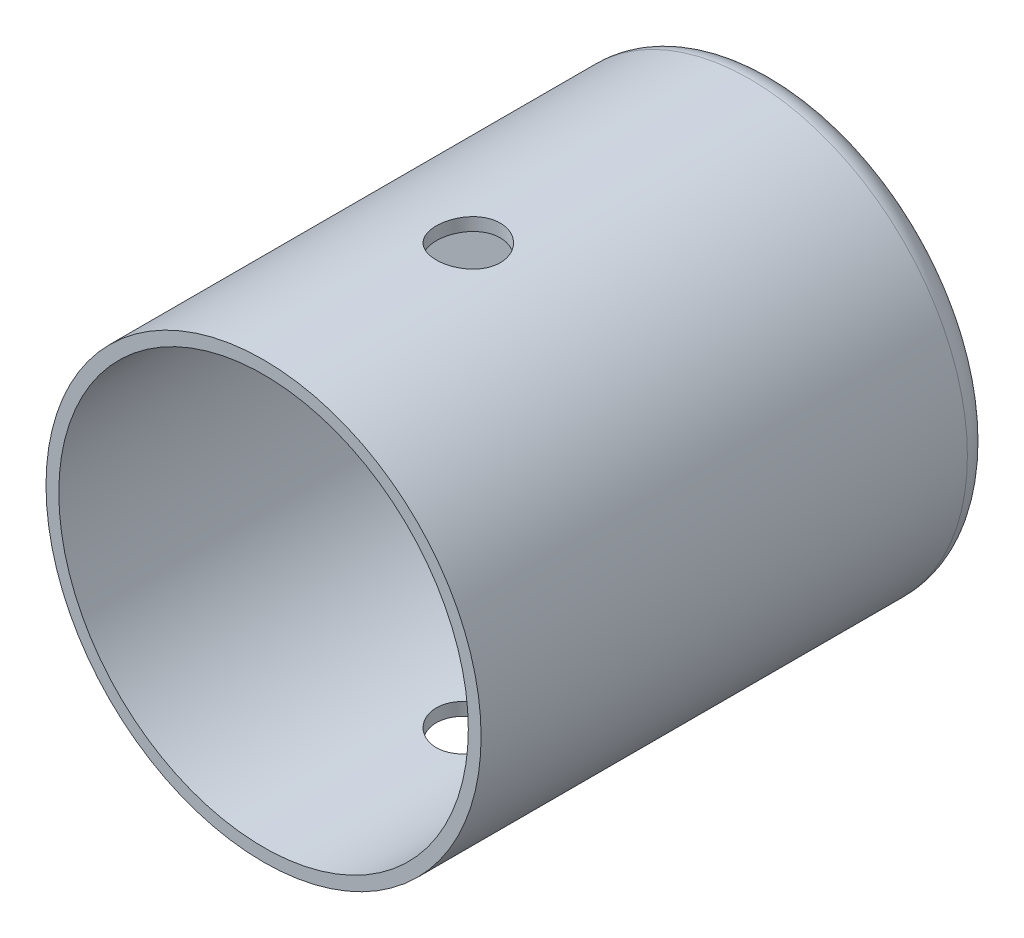
ISO-10303-21;
HEADER;
FILE_DESCRIPTION(('STEP AP214'),'2;1');
FILE_NAME('part.step','',(''),(''),'','','');
FILE_SCHEMA(('AUTOMOTIVE_DESIGN { 1 0 10303 214 1 1 1 1 }'));
ENDSEC;
DATA;
#1=APPLICATION_CONTEXT('core data for automotive mechanical design processes');
#2=APPLICATION_PROTOCOL_DEFINITION('international standard','automotive_design',2000,#1);
#3=PRODUCT_CONTEXT('',#1,'mechanical');
#4=PRODUCT('Part','Part','',(#3));
#5=PRODUCT_RELATED_PRODUCT_CATEGORY('part','',(#4));
#6=PRODUCT_DEFINITION_FORMATION('','',#4);
#7=PRODUCT_DEFINITION_CONTEXT('part definition',#1,'design');
#8=PRODUCT_DEFINITION('design','',#6,#7);
#9=PRODUCT_DEFINITION_SHAPE('','',#8);
#10=(LENGTH_UNIT() NAMED_UNIT(*) SI_UNIT(.MILLI.,.METRE.));
#11=(NAMED_UNIT(*) PLANE_ANGLE_UNIT() SI_UNIT($,.RADIAN.));
#12=(NAMED_UNIT(*) SI_UNIT($,.STERADIAN.) SOLID_ANGLE_UNIT());
#13=UNCERTAINTY_MEASURE_WITH_UNIT(LENGTH_MEASURE(1.E-05),#10,'distance_accuracy_value','');
#14=(GEOMETRIC_REPRESENTATION_CONTEXT(3) GLOBAL_UNCERTAINTY_ASSIGNED_CONTEXT((#13)) GLOBAL_UNIT_ASSIGNED_CONTEXT((#10,
#11,#12)) REPRESENTATION_CONTEXT('',''));
#15=CARTESIAN_POINT('',(0.,0.,0.));
#16=DIRECTION('',(0.,0.,1.));
#17=DIRECTION('',(1.,0.,0.));
#18=AXIS2_PLACEMENT_3D('',#15,#16,#17);
#19=CARTESIAN_POINT('',(0.,0.,12.));
#20=DIRECTION('',(0.,0.,-1.));
#21=DIRECTION('',(-1.,0.,0.));
#22=AXIS2_PLACEMENT_3D('',#19,#20,#21);
#23=CYLINDRICAL_SURFACE('',#22,17.);
#24=CARTESIAN_POINT('',(0.,0.,2.));
#25=DIRECTION('',(0.,0.,1.));
#26=DIRECTION('',(1.,0.,0.));
#27=AXIS2_PLACEMENT_3D('',#24,#25,#26);
#28=CIRCLE('',#27,17.);
#29=CARTESIAN_POINT('',(17.,0.,2.));
#30=VERTEX_POINT('',#29);
#31=EDGE_CURVE('E48',#30,#30,#28,.T.);
#32=ORIENTED_EDGE('',*,*,#31,.T.);
#33=EDGE_LOOP('',(#32));
#34=FACE_BOUND('',#33,.T.);
#35=CARTESIAN_POINT('',(0.,-17.,26.5));
#36=CARTESIAN_POINT('',(0.139618263933644,-16.999997793131,26.4999942181081));
#37=CARTESIAN_POINT('',(0.279318334742722,-16.9982619631343,26.4882645651211));
#38=CARTESIAN_POINT('',(0.554815864347195,-16.9915044414465,26.4416664885911));
#39=CARTESIAN_POINT('',(0.690609351356019,-16.9864795210156,26.4067753280472));
#40=CARTESIAN_POINT('',(0.954266664820791,-16.9737086836159,26.3149174733872));
#41=CARTESIAN_POINT('',(1.08213631987448,-16.9659647952965,26.2579672345128));
#42=CARTESIAN_POINT('',(1.3264840365203,-16.9486124241397,26.1236475337935));
#43=CARTESIAN_POINT('',(1.44296372374599,-16.9390042079744,26.0462809917132));
#44=CARTESIAN_POINT('',(1.66212119979329,-16.9189113868221,25.8727046523535));
#45=CARTESIAN_POINT('',(1.76470092382526,-16.9084213236713,25.7763716572785));
#46=CARTESIAN_POINT('',(1.95230070871524,-16.887789985922,25.5678620163514));
#47=CARTESIAN_POINT('',(2.03731977497713,-16.8776487311065,25.4556844737053));
#48=CARTESIAN_POINT('',(2.18776463859896,-16.8588102121396,25.2180137363662));
#49=CARTESIAN_POINT('',(2.25309591742832,-16.8501200004422,25.0924601042765));
#50=CARTESIAN_POINT('',(2.36170671911329,-16.8352417558288,24.8320129732306));
#51=CARTESIAN_POINT('',(2.40498739680279,-16.8290535918791,24.6971199638164));
#52=CARTESIAN_POINT('',(2.46796464304165,-16.819933589302,24.4228530062869));
#53=CARTESIAN_POINT('',(2.4878288374678,-16.8169786171038,24.2835183316785));
#54=CARTESIAN_POINT('',(2.50392846030982,-16.8145892786749,24.003464386118));
#55=CARTESIAN_POINT('',(2.50016519348747,-16.8151547180392,23.8627451920508));
#56=CARTESIAN_POINT('',(2.46925378270774,-16.8197211578168,23.5850988051509));
#57=CARTESIAN_POINT('',(2.44229207080977,-16.8236947679923,23.4481503408737));
#58=CARTESIAN_POINT('',(2.36604083270518,-16.8345870467401,23.1807425557001));
#59=CARTESIAN_POINT('',(2.31675069735604,-16.8415057956586,23.050283411947));
#60=CARTESIAN_POINT('',(2.19704705914093,-16.857539142223,22.7989887816149));
#61=CARTESIAN_POINT('',(2.12655433007144,-16.8666619500121,22.678191579542));
#62=CARTESIAN_POINT('',(1.96650298810832,-16.8860695216999,22.4500699591038));
#63=CARTESIAN_POINT('',(1.87694317178514,-16.8963543589216,22.3427463918144));
#64=CARTESIAN_POINT('',(1.6802753243751,-16.9170482652418,22.1435378637112));
#65=CARTESIAN_POINT('',(1.57300695254414,-16.9274575785055,22.0518111500901));
#66=CARTESIAN_POINT('',(1.34451413749424,-16.9471357134677,21.887638309751));
#67=CARTESIAN_POINT('',(1.22328963737823,-16.9564045305161,21.8151922616415));
#68=CARTESIAN_POINT('',(0.970190436846701,-16.9727664753804,21.6916301135368));
#69=CARTESIAN_POINT('',(0.838309834869857,-16.9798583870044,21.6405259310717));
#70=CARTESIAN_POINT('',(0.567710944898676,-16.991057196357,21.5612342283985));
#71=CARTESIAN_POINT('',(0.428993101669628,-16.9951642879764,21.5330452196304));
#72=CARTESIAN_POINT('',(0.15002351928223,-16.9999050818336,21.5005937968128));
#73=CARTESIAN_POINT('',(0.00979761097236531,-17.0005703732726,21.4961137704723));
#74=CARTESIAN_POINT('',(-0.269403415413676,-16.9984385067869,21.5106302951339));
#75=CARTESIAN_POINT('',(-0.408378570541142,-16.9956414517703,21.5296261483847));
#76=CARTESIAN_POINT('',(-0.680476104424862,-16.9869187192332,21.5903742721309));
#77=CARTESIAN_POINT('',(-0.813622595189718,-16.9810075822558,21.6320208091092));
#78=CARTESIAN_POINT('',(-1.07104301967474,-16.9667174597167,21.7367768070214));
#79=CARTESIAN_POINT('',(-1.19531655049811,-16.9583383621802,21.7998872418232));
#80=CARTESIAN_POINT('',(-1.43242218615397,-16.9399652839742,21.94629211294));
#81=CARTESIAN_POINT('',(-1.54516798121673,-16.9299603948874,22.0297249357443));
#82=CARTESIAN_POINT('',(-1.75513489222198,-16.9094840590999,22.2142131712884));
#83=CARTESIAN_POINT('',(-1.85235514217674,-16.8990125864157,22.3152695663831));
#84=CARTESIAN_POINT('',(-2.02930056628108,-16.8786834541762,22.5331038420833));
#85=CARTESIAN_POINT('',(-2.10888006584901,-16.8688313544641,22.6500006506408));
#86=CARTESIAN_POINT('',(-2.24727323997786,-16.8509540599789,22.8956301073293));
#87=CARTESIAN_POINT('',(-2.3060874583028,-16.8429288173692,23.0243624454214));
#88=CARTESIAN_POINT('',(-2.40105348668989,-16.8296538581595,23.2895698311896));
#89=CARTESIAN_POINT('',(-2.43728264767767,-16.8243946779348,23.4260166863741));
#90=CARTESIAN_POINT('',(-2.48629673443479,-16.8172219020188,23.7031411531762));
#91=CARTESIAN_POINT('',(-2.4990832109862,-16.815308085025,23.8438184843133));
#92=CARTESIAN_POINT('',(-2.50081314025998,-16.8150507670265,24.1239589898984));
#93=CARTESIAN_POINT('',(-2.48998561242761,-16.8166729719777,24.2634207727804));
#94=CARTESIAN_POINT('',(-2.4452849279886,-16.8232304869986,24.5385173126761));
#95=CARTESIAN_POINT('',(-2.41141180268506,-16.8281657925681,24.6741520748879));
#96=CARTESIAN_POINT('',(-2.32166128628094,-16.8407816094163,24.9376851195551));
#97=CARTESIAN_POINT('',(-2.265799280287,-16.8484602009356,25.065588739286));
#98=CARTESIAN_POINT('',(-2.13367943489691,-16.8656998369544,25.3102452268788));
#99=CARTESIAN_POINT('',(-2.05742095912403,-16.8752609401864,25.4269977466683));
#100=CARTESIAN_POINT('',(-1.88583847980749,-16.8952988011725,25.6472024177831));
#101=CARTESIAN_POINT('',(-1.79034469442663,-16.9057832085905,25.7505215943461));
#102=CARTESIAN_POINT('',(-1.58336095356046,-16.92642201351,25.9397507805396));
#103=CARTESIAN_POINT('',(-1.47186727949618,-16.9365763336202,26.0256567318852));
#104=CARTESIAN_POINT('',(-1.23535773881122,-16.9554718925697,26.1780241917968));
#105=CARTESIAN_POINT('',(-1.11027358494527,-16.9642053874589,26.2443806415313));
#106=CARTESIAN_POINT('',(-0.850667584310128,-16.9791991247469,26.3550443003183));
#107=CARTESIAN_POINT('',(-0.716155741284793,-16.9854619433621,26.3993744891167));
#108=CARTESIAN_POINT('',(-0.484190218187674,-16.9933688461727,26.4545995293981));
#109=CARTESIAN_POINT('',(-0.388172624228651,-16.9958428419025,26.4715988867554));
#110=CARTESIAN_POINT('',(-0.194783283695077,-16.9991591791261,26.4943010729119));
#111=CARTESIAN_POINT('',(-0.0974115529944623,-17.0000015397308,26.5000040340214));
#112=CARTESIAN_POINT('',(0.,-17.,26.5));
#113=B_SPLINE_CURVE_WITH_KNOTS('',3,(#35,#36,#37,#38,#39,#40,#41,#42,#43,#44,#45,#46,#47,#48,
#49,#50,#51,#52,#53,#54,#55,#56,#57,#58,#59,#60,#61,#62,#63,#64,#65,#66,#67,#68,#69,#70,#71,#72,
#73,#74,#75,#76,#77,#78,#79,#80,#81,#82,#83,#84,#85,#86,#87,#88,#89,#90,#91,#92,#93,#94,#95,#96,
#97,#98,#99,#100,#101,#102,#103,#104,#105,#106,#107,#108,#109,#110,#111,#112),.UNSPECIFIED.,.T.,
.F.,(4,2,2,2,2,2,2,2,2,2,2,2,2,2,2,2,2,2,2,2,2,2,2,2,2,2,2,2,2,2,2,2,2,2,2,2,2,2,4),(0.,
0.418498857511904,0.83740915233018,1.25600755579684,1.67454612732146,2.09589880308585,
2.51727533677714,2.94064374704006,3.3639899823766,3.78428694551126,4.20456069910212,
4.62148817747431,5.03842703074502,5.45694360373011,5.87548659945092,6.29805109091574,
6.72061730517519,7.14341917050654,7.56619356861207,7.98508072630458,8.40395543411031,
8.82089140788565,9.23784630155638,9.65772400348285,10.0776251172785,10.5008742387869,
10.9241122761825,11.3458926970847,11.7676452153327,12.1853255880243,12.6030053933771,
13.0203934758991,13.4377945825891,13.8590554809119,14.2804144447029,14.7039981269519,
15.1271389563846,15.4191287002785,15.7111150241882),.UNSPECIFIED.);
#114=CARTESIAN_POINT('',(0.,-17.,26.5));
#115=VERTEX_POINT('',#114);
#116=EDGE_CURVE('E91',#115,#115,#113,.T.);
#117=ORIENTED_EDGE('',*,*,#116,.T.);
#118=EDGE_LOOP('',(#117));
#119=FACE_BOUND('',#118,.T.);
#120=CARTESIAN_POINT('',(0.,17.,26.5));
#121=CARTESIAN_POINT('',(-0.139618263933644,16.999997793131,26.4999942181081));
#122=CARTESIAN_POINT('',(-0.279318334742722,16.9982619631343,26.4882645651211));
#123=CARTESIAN_POINT('',(-0.554815864347195,16.9915044414465,26.4416664885911));
#124=CARTESIAN_POINT('',(-0.690609351356019,16.9864795210156,26.4067753280472));
#125=CARTESIAN_POINT('',(-0.954266664820791,16.9737086836159,26.3149174733872));
#126=CARTESIAN_POINT('',(-1.08213631987448,16.9659647952965,26.2579672345128));
#127=CARTESIAN_POINT('',(-1.3264840365203,16.9486124241397,26.1236475337935));
#128=CARTESIAN_POINT('',(-1.44296372374599,16.9390042079744,26.0462809917132));
#129=CARTESIAN_POINT('',(-1.66212119979329,16.9189113868221,25.8727046523535));
#130=CARTESIAN_POINT('',(-1.76470092382526,16.9084213236713,25.7763716572785));
#131=CARTESIAN_POINT('',(-1.95230070871524,16.887789985922,25.5678620163514));
#132=CARTESIAN_POINT('',(-2.03731977497713,16.8776487311065,25.4556844737053));
#133=CARTESIAN_POINT('',(-2.18776463859896,16.8588102121396,25.2180137363662));
#134=CARTESIAN_POINT('',(-2.25309591742832,16.8501200004422,25.0924601042765));
#135=CARTESIAN_POINT('',(-2.36170671911329,16.8352417558288,24.8320129732306));
#136=CARTESIAN_POINT('',(-2.40498739680279,16.8290535918791,24.6971199638164));
#137=CARTESIAN_POINT('',(-2.46796464304165,16.819933589302,24.4228530062869));
#138=CARTESIAN_POINT('',(-2.4878288374678,16.8169786171038,24.2835183316785));
#139=CARTESIAN_POINT('',(-2.50392846030982,16.8145892786749,24.003464386118));
#140=CARTESIAN_POINT('',(-2.50016519348747,16.8151547180392,23.8627451920508));
#141=CARTESIAN_POINT('',(-2.46925378270774,16.8197211578168,23.5850988051509));
#142=CARTESIAN_POINT('',(-2.44229207080977,16.8236947679923,23.4481503408737));
#143=CARTESIAN_POINT('',(-2.36604083270518,16.8345870467401,23.1807425557001));
#144=CARTESIAN_POINT('',(-2.31675069735604,16.8415057956586,23.050283411947));
#145=CARTESIAN_POINT('',(-2.19704705914093,16.857539142223,22.7989887816149));
#146=CARTESIAN_POINT('',(-2.12655433007144,16.8666619500121,22.678191579542));
#147=CARTESIAN_POINT('',(-1.96650298810832,16.8860695216999,22.4500699591038));
#148=CARTESIAN_POINT('',(-1.87694317178514,16.8963543589216,22.3427463918144));
#149=CARTESIAN_POINT('',(-1.6802753243751,16.9170482652418,22.1435378637112));
#150=CARTESIAN_POINT('',(-1.57300695254414,16.9274575785055,22.0518111500901));
#151=CARTESIAN_POINT('',(-1.34451413749424,16.9471357134677,21.887638309751));
#152=CARTESIAN_POINT('',(-1.22328963737823,16.9564045305161,21.8151922616415));
#153=CARTESIAN_POINT('',(-0.970190436846701,16.9727664753804,21.6916301135368));
#154=CARTESIAN_POINT('',(-0.838309834869857,16.9798583870044,21.6405259310717));
#155=CARTESIAN_POINT('',(-0.567710944898676,16.991057196357,21.5612342283985));
#156=CARTESIAN_POINT('',(-0.428993101669628,16.9951642879764,21.5330452196304));
#157=CARTESIAN_POINT('',(-0.15002351928223,16.9999050818336,21.5005937968128));
#158=CARTESIAN_POINT('',(-0.00979761097236531,17.0005703732726,21.4961137704723));
#159=CARTESIAN_POINT('',(0.269403415413676,16.9984385067869,21.5106302951339));
#160=CARTESIAN_POINT('',(0.408378570541142,16.9956414517703,21.5296261483847));
#161=CARTESIAN_POINT('',(0.680476104424862,16.9869187192332,21.5903742721309));
#162=CARTESIAN_POINT('',(0.813622595189718,16.9810075822558,21.6320208091092));
#163=CARTESIAN_POINT('',(1.07104301967474,16.9667174597167,21.7367768070214));
#164=CARTESIAN_POINT('',(1.19531655049811,16.9583383621802,21.7998872418232));
#165=CARTESIAN_POINT('',(1.43242218615397,16.9399652839742,21.94629211294));
#166=CARTESIAN_POINT('',(1.54516798121673,16.9299603948874,22.0297249357443));
#167=CARTESIAN_POINT('',(1.75513489222198,16.9094840590999,22.2142131712884));
#168=CARTESIAN_POINT('',(1.85235514217674,16.8990125864157,22.3152695663831));
#169=CARTESIAN_POINT('',(2.02930056628108,16.8786834541762,22.5331038420833));
#170=CARTESIAN_POINT('',(2.10888006584901,16.8688313544641,22.6500006506408));
#171=CARTESIAN_POINT('',(2.24727323997786,16.8509540599789,22.8956301073293));
#172=CARTESIAN_POINT('',(2.3060874583028,16.8429288173692,23.0243624454214));
#173=CARTESIAN_POINT('',(2.40105348668989,16.8296538581595,23.2895698311896));
#174=CARTESIAN_POINT('',(2.43728264767767,16.8243946779348,23.4260166863741));
#175=CARTESIAN_POINT('',(2.48629673443479,16.8172219020188,23.7031411531762));
#176=CARTESIAN_POINT('',(2.4990832109862,16.815308085025,23.8438184843133));
#177=CARTESIAN_POINT('',(2.50081314025998,16.8150507670265,24.1239589898984));
#178=CARTESIAN_POINT('',(2.48998561242761,16.8166729719777,24.2634207727804));
#179=CARTESIAN_POINT('',(2.4452849279886,16.8232304869986,24.5385173126761));
#180=CARTESIAN_POINT('',(2.41141180268506,16.8281657925681,24.6741520748879));
#181=CARTESIAN_POINT('',(2.32166128628094,16.8407816094163,24.9376851195551));
#182=CARTESIAN_POINT('',(2.265799280287,16.8484602009356,25.065588739286));
#183=CARTESIAN_POINT('',(2.13367943489691,16.8656998369544,25.3102452268788));
#184=CARTESIAN_POINT('',(2.05742095912403,16.8752609401864,25.4269977466683));
#185=CARTESIAN_POINT('',(1.88583847980749,16.8952988011725,25.6472024177831));
#186=CARTESIAN_POINT('',(1.79034469442663,16.9057832085905,25.7505215943461));
#187=CARTESIAN_POINT('',(1.58336095356046,16.92642201351,25.9397507805396));
#188=CARTESIAN_POINT('',(1.47186727949618,16.9365763336202,26.0256567318852));
#189=CARTESIAN_POINT('',(1.23535773881122,16.9554718925697,26.1780241917968));
#190=CARTESIAN_POINT('',(1.11027358494527,16.9642053874589,26.2443806415313));
#191=CARTESIAN_POINT('',(0.850667584310128,16.9791991247469,26.3550443003183));
#192=CARTESIAN_POINT('',(0.716155741284793,16.9854619433621,26.3993744891167));
#193=CARTESIAN_POINT('',(0.484190218187674,16.9933688461727,26.4545995293981));
#194=CARTESIAN_POINT('',(0.388172624228651,16.9958428419025,26.4715988867554));
#195=CARTESIAN_POINT('',(0.194783283695077,16.9991591791261,26.4943010729119));
#196=CARTESIAN_POINT('',(0.0974115529944623,17.0000015397308,26.5000040340214));
#197=CARTESIAN_POINT('',(0.,17.,26.5));
#198=B_SPLINE_CURVE_WITH_KNOTS('',3,(#120,#121,#122,#123,#124,#125,#126,#127,#128,#129,#130,
#131,#132,#133,#134,#135,#136,#137,#138,#139,#140,#141,#142,#143,#144,#145,#146,#147,#148,#149,
#150,#151,#152,#153,#154,#155,#156,#157,#158,#159,#160,#161,#162,#163,#164,#165,#166,#167,#168,
#169,#170,#171,#172,#173,#174,#175,#176,#177,#178,#179,#180,#181,#182,#183,#184,#185,#186,#187,
#188,#189,#190,#191,#192,#193,#194,#195,#196,#197),.UNSPECIFIED.,.T.,.F.,(4,2,2,2,2,2,2,2,2,2,2,
2,2,2,2,2,2,2,2,2,2,2,2,2,2,2,2,2,2,2,2,2,2,2,2,2,2,2,4),(0.,0.418498857511904,0.83740915233018,
1.25600755579684,1.67454612732146,2.09589880308585,2.51727533677714,2.94064374704006,
3.3639899823766,3.78428694551126,4.20456069910212,4.62148817747431,5.03842703074502,
5.45694360373011,5.87548659945092,6.29805109091574,6.72061730517519,7.14341917050654,
7.56619356861207,7.98508072630458,8.40395543411031,8.82089140788565,9.23784630155638,
9.65772400348285,10.0776251172785,10.5008742387869,10.9241122761825,11.3458926970847,
11.7676452153327,12.1853255880243,12.6030053933771,13.0203934758991,13.4377945825891,
13.8590554809119,14.2804144447029,14.7039981269519,15.1271389563846,15.4191287002785,
15.7111150241882),.UNSPECIFIED.);
#199=CARTESIAN_POINT('',(0.,17.,26.5));
#200=VERTEX_POINT('',#199);
#201=EDGE_CURVE('E67',#200,#200,#198,.T.);
#202=ORIENTED_EDGE('',*,*,#201,.T.);
#203=EDGE_LOOP('',(#202));
#204=FACE_BOUND('',#203,.T.);
#205=CARTESIAN_POINT('',(0.,0.,40.));
#206=DIRECTION('',(0.,0.,1.));
#207=DIRECTION('',(1.,0.,0.));
#208=AXIS2_PLACEMENT_3D('',#205,#206,#207);
#209=CIRCLE('',#208,17.);
#210=CARTESIAN_POINT('',(17.,0.,40.));
#211=VERTEX_POINT('',#210);
#212=EDGE_CURVE('E56',#211,#211,#209,.T.);
#213=ORIENTED_EDGE('',*,*,#212,.F.);
#214=EDGE_LOOP('',(#213));
#215=FACE_BOUND('',#214,.T.);
#216=ADVANCED_FACE('F41',(#34,#119,#204,#215),#23,.T.);
#217=CARTESIAN_POINT('',(0.,0.,0.));
#218=DIRECTION('',(0.,0.,1.));
#219=DIRECTION('',(1.,0.,0.));
#220=AXIS2_PLACEMENT_3D('',#217,#218,#219);
#221=PLANE('',#220);
#222=CARTESIAN_POINT('',(0.,0.,0.));
#223=DIRECTION('',(0.,0.,1.));
#224=DIRECTION('',(1.,0.,0.));
#225=AXIS2_PLACEMENT_3D('',#222,#223,#224);
#226=CIRCLE('',#225,15.);
#227=CARTESIAN_POINT('',(15.,0.,0.));
#228=VERTEX_POINT('',#227);
#229=EDGE_CURVE('E10',#228,#228,#226,.F.);
#230=ORIENTED_EDGE('',*,*,#229,.T.);
#231=EDGE_LOOP('',(#230));
#232=FACE_BOUND('',#231,.T.);
#233=ADVANCED_FACE('F99',(#232),#221,.F.);
#234=CARTESIAN_POINT('',(0.,0.,40.));
#235=DIRECTION('',(0.,0.,-1.));
#236=DIRECTION('',(-1.,0.,0.));
#237=AXIS2_PLACEMENT_3D('',#234,#235,#236);
#238=CYLINDRICAL_SURFACE('',#237,16.);
#239=CARTESIAN_POINT('',(0.,-16.,26.5));
#240=CARTESIAN_POINT('',(0.139515097271033,-15.9999977019448,26.4999943017285));
#241=CARTESIAN_POINT('',(0.279109404865704,-15.9981561248574,26.4882818862264));
#242=CARTESIAN_POINT('',(0.554391314978102,-15.9909869809759,26.4417563087232));
#243=CARTESIAN_POINT('',(0.690075061323317,-15.9856560884472,26.4069211074965));
#244=CARTESIAN_POINT('',(0.953512538047403,-15.9721069716578,26.3152203371934));
#245=CARTESIAN_POINT('',(1.0812723522899,-15.9638909956317,26.2583719186384));
#246=CARTESIAN_POINT('',(1.3254212510446,-15.9454779403815,26.1243014548584));
#247=CARTESIAN_POINT('',(1.44181181036831,-15.9352811186255,26.0470820569641));
#248=CARTESIAN_POINT('',(1.66091991165162,-15.9139426841436,25.873766951646));
#249=CARTESIAN_POINT('',(1.76352747914264,-15.9027945139234,25.7775330051098));
#250=CARTESIAN_POINT('',(1.95120768822823,-15.8808607613029,25.5692180517311));
#251=CARTESIAN_POINT('',(2.03627928654192,-15.8700752005075,25.4571361026998));
#252=CARTESIAN_POINT('',(2.18690544328884,-15.8500242812745,25.2195617286563));
#253=CARTESIAN_POINT('',(2.25235273557991,-15.840767397861,25.0940005176382));
#254=CARTESIAN_POINT('',(2.36118681597065,-15.8249120174236,24.8334985891422));
#255=CARTESIAN_POINT('',(2.40457491010063,-15.8183133630222,24.6985584274894));
#256=CARTESIAN_POINT('',(2.46771559322167,-15.8085863451104,24.4242890988562));
#257=CARTESIAN_POINT('',(2.48765705487496,-15.8054302653236,24.2850044141812));
#258=CARTESIAN_POINT('',(2.50392369757621,-15.8028617107177,24.0050328111074));
#259=CARTESIAN_POINT('',(2.50025034860466,-15.8034490028802,23.864345980534));
#260=CARTESIAN_POINT('',(2.4695458080889,-15.8082755045521,23.5869029681473));
#261=CARTESIAN_POINT('',(2.44272562959693,-15.8124817218495,23.4501227766469));
#262=CARTESIAN_POINT('',(2.36681937833751,-15.8240205634547,23.1830279936407));
#263=CARTESIAN_POINT('',(2.31773262684132,-15.8313532830641,23.0527135993595));
#264=CARTESIAN_POINT('',(2.19846916949384,-15.8483550685462,22.8016112873228));
#265=CARTESIAN_POINT('',(2.12820372315549,-15.8580339308724,22.6808662082269));
#266=CARTESIAN_POINT('',(1.96864058146637,-15.878630461501,22.4528004643145));
#267=CARTESIAN_POINT('',(1.87934153253017,-15.8895482178821,22.3454807551125));
#268=CARTESIAN_POINT('',(1.68309088822333,-15.911537862489,22.1460897533667));
#269=CARTESIAN_POINT('',(1.57595800560539,-15.9226101363559,22.0541968417305));
#270=CARTESIAN_POINT('',(1.34769694737936,-15.9435512534783,21.8896668543601));
#271=CARTESIAN_POINT('',(1.22656870068132,-15.9534200906202,21.8170298764432));
#272=CARTESIAN_POINT('',(0.973595927056489,-15.9708539902704,21.6930619265776));
#273=CARTESIAN_POINT('',(0.841744186240459,-15.9784174854193,21.641745441467));
#274=CARTESIAN_POINT('',(0.571149534696758,-15.9903756000068,21.5620340325528));
#275=CARTESIAN_POINT('',(0.432407130687199,-15.9947704520898,21.5336374259335));
#276=CARTESIAN_POINT('',(0.153508336763734,-15.9998651172728,21.5008107235498));
#277=CARTESIAN_POINT('',(0.013381461508701,-16.0006027179286,21.4961355210238));
#278=CARTESIAN_POINT('',(-0.265654546411643,-15.9984028649127,21.510232705336));
#279=CARTESIAN_POINT('',(-0.404563719925156,-15.9954655349964,21.5290043025891));
#280=CARTESIAN_POINT('',(-0.676473446265704,-15.9862692369322,21.5892583876802));
#281=CARTESIAN_POINT('',(-0.80950126205604,-15.9800278421539,21.6306207582677));
#282=CARTESIAN_POINT('',(-1.06673406785662,-15.9649207568356,21.7347550943988));
#283=CARTESIAN_POINT('',(-1.19093861303941,-15.9560549341007,21.7975281384427));
#284=CARTESIAN_POINT('',(-1.42807220225041,-15.9365897274094,21.9432719911266));
#285=CARTESIAN_POINT('',(-1.54090512378372,-15.9259772866342,22.0263974200905));
#286=CARTESIAN_POINT('',(-1.75110696507806,-15.9042388046444,22.2102720859078));
#287=CARTESIAN_POINT('',(-1.84847490447018,-15.8931127309268,22.3110224392049));
#288=CARTESIAN_POINT('',(-2.02588080776691,-15.8714802753665,22.5283811972172));
#289=CARTESIAN_POINT('',(-2.10575398584126,-15.860980411908,22.6451248471223));
#290=CARTESIAN_POINT('',(-2.2447556772664,-15.8419069280583,22.8905160736613));
#291=CARTESIAN_POINT('',(-2.30388478778105,-15.83333325222,23.0191633074895));
#292=CARTESIAN_POINT('',(-2.39946771944995,-15.8191307135236,23.2842296407142));
#293=CARTESIAN_POINT('',(-2.43600654947912,-15.8134908234896,23.4206174687656));
#294=CARTESIAN_POINT('',(-2.48564122040535,-15.8057657028079,23.697689143664));
#295=CARTESIAN_POINT('',(-2.49873883084997,-15.8036802038444,23.838372665419));
#296=CARTESIAN_POINT('',(-2.50107452690756,-15.8033105804488,24.1183987159075));
#297=CARTESIAN_POINT('',(-2.49057180548425,-15.804985160429,24.2577390969335));
#298=CARTESIAN_POINT('',(-2.44656223255901,-15.8118569894183,24.5326452971443));
#299=CARTESIAN_POINT('',(-2.41305543086961,-15.8170542307995,24.6682111245017));
#300=CARTESIAN_POINT('',(-2.32408329891851,-15.8303708885491,24.9316378266405));
#301=CARTESIAN_POINT('',(-2.26863761738581,-15.8384876895341,25.0595054782584));
#302=CARTESIAN_POINT('',(-2.13738768546417,-15.856731840474,25.3041656136763));
#303=CARTESIAN_POINT('',(-2.06158262820886,-15.8668592701083,25.4209576582884));
#304=CARTESIAN_POINT('',(-1.89083008139079,-15.8881156809226,25.6414655441268));
#305=CARTESIAN_POINT('',(-1.79569107094768,-15.8992540116029,25.7450321966138));
#306=CARTESIAN_POINT('',(-1.58937594638204,-15.9212004364073,25.9348212363867));
#307=CARTESIAN_POINT('',(-1.47819612078432,-15.9320084534012,26.0210395985919));
#308=CARTESIAN_POINT('',(-1.24216685884341,-15.952151024567,26.1741512230316));
#309=CARTESIAN_POINT('',(-1.11723937214238,-15.9614763443027,26.2409253727596));
#310=CARTESIAN_POINT('',(-0.857851882357782,-15.9775125983888,26.3524409961929));
#311=CARTESIAN_POINT('',(-0.72340177658176,-15.9842262014212,26.3972049725584));
#312=CARTESIAN_POINT('',(-0.490314239911593,-15.9927744586488,26.4534330210906));
#313=CARTESIAN_POINT('',(-0.393105575651624,-15.9954699162612,26.470868490629));
#314=CARTESIAN_POINT('',(-0.197277797850582,-15.9990834869762,26.4941539133791));
#315=CARTESIAN_POINT('',(-0.0986587041691185,-16.0000016250796,26.5000040295573));
#316=CARTESIAN_POINT('',(0.,-16.,26.5));
#317=B_SPLINE_CURVE_WITH_KNOTS('',3,(#239,#240,#241,#242,#243,#244,#245,#246,#247,#248,#249,
#250,#251,#252,#253,#254,#255,#256,#257,#258,#259,#260,#261,#262,#263,#264,#265,#266,#267,#268,
#269,#270,#271,#272,#273,#274,#275,#276,#277,#278,#279,#280,#281,#282,#283,#284,#285,#286,#287,
#288,#289,#290,#291,#292,#293,#294,#295,#296,#297,#298,#299,#300,#301,#302,#303,#304,#305,#306,
#307,#308,#309,#310,#311,#312,#313,#314,#315,#316),.UNSPECIFIED.,.T.,.F.,(4,2,2,2,2,2,2,2,2,2,2,
2,2,2,2,2,2,2,2,2,2,2,2,2,2,2,2,2,2,2,2,2,2,2,2,2,2,2,4),(0.,0.418184740477491,
0.836768642528014,1.25502707944103,1.6732311879203,2.09459568152199,2.51598523645422,
2.93963778605759,3.36326525009238,3.78345631134995,4.20362121670545,4.6199957602258,
5.0363829965105,5.45453977402347,5.87272629892068,6.29545732334367,6.71819049513827,
7.14121043754564,7.56419931829866,7.98280854005914,8.40140366528356,8.81779444756566,
9.2342062074203,9.65388541469671,10.0735912160142,10.4970948024959,10.9205861964898,
11.3424741039513,11.764330162293,12.1815758159869,12.598820566189,13.0156924696662,
13.4325808967135,13.8538201231554,14.275156971423,14.6990230419984,15.1224548565628,
15.4181801635154,15.7139013105871),.UNSPECIFIED.);
#318=CARTESIAN_POINT('',(0.,-16.,26.5));
#319=VERTEX_POINT('',#318);
#320=EDGE_CURVE('E59',#319,#319,#317,.T.);
#321=ORIENTED_EDGE('',*,*,#320,.F.);
#322=EDGE_LOOP('',(#321));
#323=FACE_BOUND('',#322,.T.);
#324=CARTESIAN_POINT('',(0.,16.,26.5));
#325=CARTESIAN_POINT('',(-0.139515097271033,15.9999977019448,26.4999943017285));
#326=CARTESIAN_POINT('',(-0.279109404865704,15.9981561248574,26.4882818862264));
#327=CARTESIAN_POINT('',(-0.554391314978102,15.9909869809759,26.4417563087232));
#328=CARTESIAN_POINT('',(-0.690075061323317,15.9856560884472,26.4069211074965));
#329=CARTESIAN_POINT('',(-0.953512538047403,15.9721069716578,26.3152203371934));
#330=CARTESIAN_POINT('',(-1.0812723522899,15.9638909956317,26.2583719186384));
#331=CARTESIAN_POINT('',(-1.3254212510446,15.9454779403815,26.1243014548584));
#332=CARTESIAN_POINT('',(-1.44181181036831,15.9352811186255,26.0470820569641));
#333=CARTESIAN_POINT('',(-1.66091991165162,15.9139426841436,25.873766951646));
#334=CARTESIAN_POINT('',(-1.76352747914264,15.9027945139234,25.7775330051098));
#335=CARTESIAN_POINT('',(-1.95120768822823,15.8808607613029,25.5692180517311));
#336=CARTESIAN_POINT('',(-2.03627928654192,15.8700752005075,25.4571361026998));
#337=CARTESIAN_POINT('',(-2.18690544328884,15.8500242812745,25.2195617286563));
#338=CARTESIAN_POINT('',(-2.25235273557991,15.840767397861,25.0940005176382));
#339=CARTESIAN_POINT('',(-2.36118681597065,15.8249120174236,24.8334985891422));
#340=CARTESIAN_POINT('',(-2.40457491010063,15.8183133630222,24.6985584274894));
#341=CARTESIAN_POINT('',(-2.46771559322167,15.8085863451104,24.4242890988562));
#342=CARTESIAN_POINT('',(-2.48765705487496,15.8054302653236,24.2850044141812));
#343=CARTESIAN_POINT('',(-2.50392369757621,15.8028617107177,24.0050328111074));
#344=CARTESIAN_POINT('',(-2.50025034860466,15.8034490028802,23.864345980534));
#345=CARTESIAN_POINT('',(-2.4695458080889,15.8082755045521,23.5869029681473));
#346=CARTESIAN_POINT('',(-2.44272562959693,15.8124817218495,23.4501227766469));
#347=CARTESIAN_POINT('',(-2.36681937833751,15.8240205634547,23.1830279936407));
#348=CARTESIAN_POINT('',(-2.31773262684132,15.8313532830641,23.0527135993595));
#349=CARTESIAN_POINT('',(-2.19846916949384,15.8483550685462,22.8016112873228));
#350=CARTESIAN_POINT('',(-2.12820372315549,15.8580339308724,22.6808662082269));
#351=CARTESIAN_POINT('',(-1.96864058146637,15.878630461501,22.4528004643145));
#352=CARTESIAN_POINT('',(-1.87934153253017,15.8895482178821,22.3454807551125));
#353=CARTESIAN_POINT('',(-1.68309088822333,15.911537862489,22.1460897533667));
#354=CARTESIAN_POINT('',(-1.57595800560539,15.9226101363559,22.0541968417305));
#355=CARTESIAN_POINT('',(-1.34769694737936,15.9435512534783,21.8896668543601));
#356=CARTESIAN_POINT('',(-1.22656870068132,15.9534200906202,21.8170298764432));
#357=CARTESIAN_POINT('',(-0.973595927056489,15.9708539902704,21.6930619265776));
#358=CARTESIAN_POINT('',(-0.841744186240459,15.9784174854193,21.641745441467));
#359=CARTESIAN_POINT('',(-0.571149534696758,15.9903756000068,21.5620340325528));
#360=CARTESIAN_POINT('',(-0.432407130687199,15.9947704520898,21.5336374259335));
#361=CARTESIAN_POINT('',(-0.153508336763734,15.9998651172728,21.5008107235498));
#362=CARTESIAN_POINT('',(-0.013381461508701,16.0006027179286,21.4961355210238));
#363=CARTESIAN_POINT('',(0.265654546411643,15.9984028649127,21.510232705336));
#364=CARTESIAN_POINT('',(0.404563719925156,15.9954655349964,21.5290043025891));
#365=CARTESIAN_POINT('',(0.676473446265704,15.9862692369322,21.5892583876802));
#366=CARTESIAN_POINT('',(0.80950126205604,15.9800278421539,21.6306207582677));
#367=CARTESIAN_POINT('',(1.06673406785662,15.9649207568356,21.7347550943988));
#368=CARTESIAN_POINT('',(1.19093861303941,15.9560549341007,21.7975281384427));
#369=CARTESIAN_POINT('',(1.42807220225041,15.9365897274094,21.9432719911266));
#370=CARTESIAN_POINT('',(1.54090512378372,15.9259772866342,22.0263974200905));
#371=CARTESIAN_POINT('',(1.75110696507806,15.9042388046444,22.2102720859078));
#372=CARTESIAN_POINT('',(1.84847490447018,15.8931127309268,22.3110224392049));
#373=CARTESIAN_POINT('',(2.02588080776691,15.8714802753665,22.5283811972172));
#374=CARTESIAN_POINT('',(2.10575398584126,15.860980411908,22.6451248471223));
#375=CARTESIAN_POINT('',(2.2447556772664,15.8419069280583,22.8905160736613));
#376=CARTESIAN_POINT('',(2.30388478778105,15.83333325222,23.0191633074895));
#377=CARTESIAN_POINT('',(2.39946771944995,15.8191307135236,23.2842296407142));
#378=CARTESIAN_POINT('',(2.43600654947912,15.8134908234896,23.4206174687656));
#379=CARTESIAN_POINT('',(2.48564122040535,15.8057657028079,23.697689143664));
#380=CARTESIAN_POINT('',(2.49873883084997,15.8036802038444,23.838372665419));
#381=CARTESIAN_POINT('',(2.50107452690756,15.8033105804488,24.1183987159075));
#382=CARTESIAN_POINT('',(2.49057180548425,15.804985160429,24.2577390969335));
#383=CARTESIAN_POINT('',(2.44656223255901,15.8118569894183,24.5326452971443));
#384=CARTESIAN_POINT('',(2.41305543086961,15.8170542307995,24.6682111245017));
#385=CARTESIAN_POINT('',(2.32408329891851,15.8303708885491,24.9316378266405));
#386=CARTESIAN_POINT('',(2.26863761738581,15.8384876895341,25.0595054782584));
#387=CARTESIAN_POINT('',(2.13738768546417,15.856731840474,25.3041656136763));
#388=CARTESIAN_POINT('',(2.06158262820886,15.8668592701083,25.4209576582884));
#389=CARTESIAN_POINT('',(1.89083008139079,15.8881156809226,25.6414655441268));
#390=CARTESIAN_POINT('',(1.79569107094768,15.8992540116029,25.7450321966138));
#391=CARTESIAN_POINT('',(1.58937594638204,15.9212004364073,25.9348212363867));
#392=CARTESIAN_POINT('',(1.47819612078432,15.9320084534012,26.0210395985919));
#393=CARTESIAN_POINT('',(1.24216685884341,15.952151024567,26.1741512230316));
#394=CARTESIAN_POINT('',(1.11723937214238,15.9614763443027,26.2409253727596));
#395=CARTESIAN_POINT('',(0.857851882357782,15.9775125983888,26.3524409961929));
#396=CARTESIAN_POINT('',(0.72340177658176,15.9842262014212,26.3972049725584));
#397=CARTESIAN_POINT('',(0.490314239911593,15.9927744586488,26.4534330210906));
#398=CARTESIAN_POINT('',(0.393105575651624,15.9954699162612,26.470868490629));
#399=CARTESIAN_POINT('',(0.197277797850582,15.9990834869762,26.4941539133791));
#400=CARTESIAN_POINT('',(0.0986587041691185,16.0000016250796,26.5000040295573));
#401=CARTESIAN_POINT('',(0.,16.,26.5));
#402=B_SPLINE_CURVE_WITH_KNOTS('',3,(#324,#325,#326,#327,#328,#329,#330,#331,#332,#333,#334,
#335,#336,#337,#338,#339,#340,#341,#342,#343,#344,#345,#346,#347,#348,#349,#350,#351,#352,#353,
#354,#355,#356,#357,#358,#359,#360,#361,#362,#363,#364,#365,#366,#367,#368,#369,#370,#371,#372,
#373,#374,#375,#376,#377,#378,#379,#380,#381,#382,#383,#384,#385,#386,#387,#388,#389,#390,#391,
#392,#393,#394,#395,#396,#397,#398,#399,#400,#401),.UNSPECIFIED.,.T.,.F.,(4,2,2,2,2,2,2,2,2,2,2,
2,2,2,2,2,2,2,2,2,2,2,2,2,2,2,2,2,2,2,2,2,2,2,2,2,2,2,4),(0.,0.418184740477491,
0.836768642528014,1.25502707944103,1.6732311879203,2.09459568152199,2.51598523645422,
2.93963778605759,3.36326525009238,3.78345631134995,4.20362121670545,4.6199957602258,
5.0363829965105,5.45453977402347,5.87272629892068,6.29545732334367,6.71819049513827,
7.14121043754564,7.56419931829866,7.98280854005914,8.40140366528356,8.81779444756566,
9.2342062074203,9.65388541469671,10.0735912160142,10.4970948024959,10.9205861964898,
11.3424741039513,11.764330162293,12.1815758159869,12.598820566189,13.0156924696662,
13.4325808967135,13.8538201231554,14.275156971423,14.6990230419984,15.1224548565628,
15.4181801635154,15.7139013105871),.UNSPECIFIED.);
#403=CARTESIAN_POINT('',(0.,16.,26.5));
#404=VERTEX_POINT('',#403);
#405=EDGE_CURVE('E68',#404,#404,#402,.T.);
#406=ORIENTED_EDGE('',*,*,#405,.F.);
#407=EDGE_LOOP('',(#406));
#408=FACE_BOUND('',#407,.T.);
#409=CARTESIAN_POINT('',(0.,0.,40.));
#410=DIRECTION('',(0.,0.,1.));
#411=DIRECTION('',(1.,0.,0.));
#412=AXIS2_PLACEMENT_3D('',#409,#410,#411);
#413=CIRCLE('',#412,16.);
#414=CARTESIAN_POINT('',(16.,0.,40.));
#415=VERTEX_POINT('',#414);
#416=EDGE_CURVE('E124',#415,#415,#413,.T.);
#417=ORIENTED_EDGE('',*,*,#416,.T.);
#418=EDGE_LOOP('',(#417));
#419=FACE_BOUND('',#418,.T.);
#420=CARTESIAN_POINT('',(0.,0.,12.));
#421=DIRECTION('',(0.,0.,1.));
#422=DIRECTION('',(1.,0.,0.));
#423=AXIS2_PLACEMENT_3D('',#420,#421,#422);
#424=CIRCLE('',#423,16.);
#425=CARTESIAN_POINT('',(16.,0.,12.));
#426=VERTEX_POINT('',#425);
#427=EDGE_CURVE('E52',#426,#426,#424,.F.);
#428=ORIENTED_EDGE('',*,*,#427,.T.);
#429=EDGE_LOOP('',(#428));
#430=FACE_BOUND('',#429,.T.);
#431=ADVANCED_FACE('F72',(#323,#408,#419,#430),#238,.F.);
#432=CARTESIAN_POINT('',(0.,0.,40.));
#433=DIRECTION('',(0.,0.,1.));
#434=DIRECTION('',(1.,0.,0.));
#435=AXIS2_PLACEMENT_3D('',#432,#433,#434);
#436=PLANE('',#435);
#437=ORIENTED_EDGE('',*,*,#416,.F.);
#438=EDGE_LOOP('',(#437));
#439=FACE_BOUND('',#438,.T.);
#440=ORIENTED_EDGE('',*,*,#212,.T.);
#441=EDGE_LOOP('',(#440));
#442=FACE_BOUND('',#441,.T.);
#443=ADVANCED_FACE('F81',(#439,#442),#436,.T.);
#444=CARTESIAN_POINT('',(0.,0.,12.));
#445=DIRECTION('',(0.,0.,1.));
#446=DIRECTION('',(1.,0.,0.));
#447=AXIS2_PLACEMENT_3D('',#444,#445,#446);
#448=PLANE('',#447);
#449=ORIENTED_EDGE('',*,*,#427,.F.);
#450=EDGE_LOOP('',(#449));
#451=FACE_BOUND('',#450,.T.);
#452=ADVANCED_FACE('F102',(#451),#448,.T.);
#453=CARTESIAN_POINT('',(0.,-17.,24.));
#454=DIRECTION('',(0.,1.,0.));
#455=DIRECTION('',(0.,0.,1.));
#456=AXIS2_PLACEMENT_3D('',#453,#454,#455);
#457=CYLINDRICAL_SURFACE('',#456,2.5);
#458=ORIENTED_EDGE('',*,*,#405,.T.);
#459=EDGE_LOOP('',(#458));
#460=FACE_BOUND('',#459,.T.);
#461=ORIENTED_EDGE('',*,*,#201,.F.);
#462=EDGE_LOOP('',(#461));
#463=FACE_BOUND('',#462,.T.);
#464=ADVANCED_FACE('F79',(#460,#463),#457,.F.);
#465=ORIENTED_EDGE('',*,*,#320,.T.);
#466=EDGE_LOOP('',(#465));
#467=FACE_BOUND('',#466,.T.);
#468=ORIENTED_EDGE('',*,*,#116,.F.);
#469=EDGE_LOOP('',(#468));
#470=FACE_BOUND('',#469,.T.);
#471=ADVANCED_FACE('F76',(#467,#470),#457,.F.);
#472=CARTESIAN_POINT('',(0.,0.,2.));
#473=DIRECTION('',(0.,0.,1.));
#474=DIRECTION('',(1.,0.,0.));
#475=AXIS2_PLACEMENT_3D('',#472,#473,#474);
#476=TOROIDAL_SURFACE('',#475,15.,2.);
#477=ORIENTED_EDGE('',*,*,#229,.F.);
#478=EDGE_LOOP('',(#477));
#479=FACE_BOUND('',#478,.T.);
#480=ORIENTED_EDGE('',*,*,#31,.F.);
#481=EDGE_LOOP('',(#480));
#482=FACE_BOUND('',#481,.T.);
#483=ADVANCED_FACE('F43',(#479,#482),#476,.T.);
#484=CLOSED_SHELL('',(#216,#233,#431,#443,#452,#464,#471,#483));
#485=MANIFOLD_SOLID_BREP('B2',#484);
#486=ADVANCED_BREP_SHAPE_REPRESENTATION('',(#18,#485),#14);
#487=SHAPE_DEFINITION_REPRESENTATION(#9,#486);
ENDSEC;
END-ISO-10303-21;
